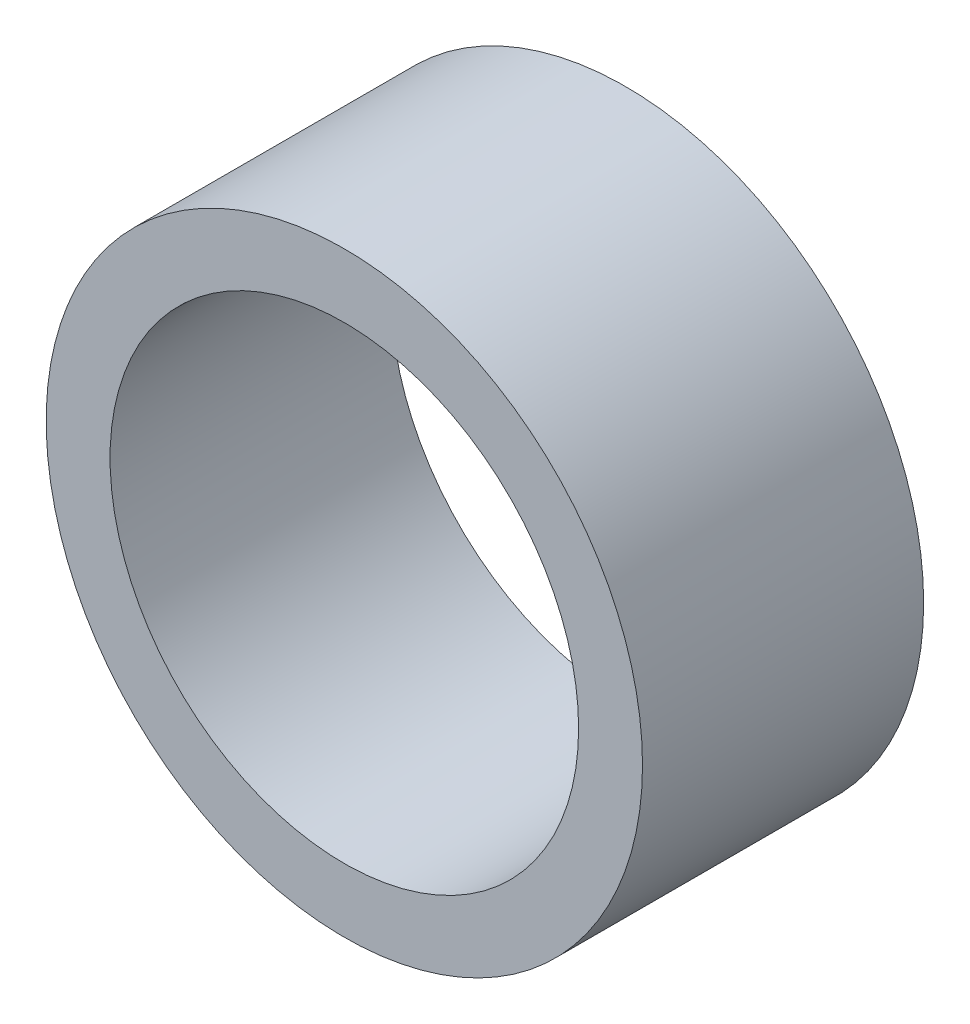
ISO-10303-21;
HEADER;
FILE_DESCRIPTION(('STEP AP214'),'2;1');
FILE_NAME('part.step','',(''),(''),'','','');
FILE_SCHEMA(('AUTOMOTIVE_DESIGN { 1 0 10303 214 1 1 1 1 }'));
ENDSEC;
DATA;
#1=APPLICATION_CONTEXT('core data for automotive mechanical design processes');
#2=APPLICATION_PROTOCOL_DEFINITION('international standard','automotive_design',2000,#1);
#3=PRODUCT_CONTEXT('',#1,'mechanical');
#4=PRODUCT('Part','Part','',(#3));
#5=PRODUCT_RELATED_PRODUCT_CATEGORY('part','',(#4));
#6=PRODUCT_DEFINITION_FORMATION('','',#4);
#7=PRODUCT_DEFINITION_CONTEXT('part definition',#1,'design');
#8=PRODUCT_DEFINITION('design','',#6,#7);
#9=PRODUCT_DEFINITION_SHAPE('','',#8);
#10=(LENGTH_UNIT() NAMED_UNIT(*) SI_UNIT(.MILLI.,.METRE.));
#11=(NAMED_UNIT(*) PLANE_ANGLE_UNIT() SI_UNIT($,.RADIAN.));
#12=(NAMED_UNIT(*) SI_UNIT($,.STERADIAN.) SOLID_ANGLE_UNIT());
#13=UNCERTAINTY_MEASURE_WITH_UNIT(LENGTH_MEASURE(1.E-05),#10,'distance_accuracy_value','');
#14=(GEOMETRIC_REPRESENTATION_CONTEXT(3) GLOBAL_UNCERTAINTY_ASSIGNED_CONTEXT((#13)) GLOBAL_UNIT_ASSIGNED_CONTEXT((#10,
#11,#12)) REPRESENTATION_CONTEXT('',''));
#15=CARTESIAN_POINT('',(0.,0.,0.));
#16=DIRECTION('',(0.,0.,1.));
#17=DIRECTION('',(1.,0.,0.));
#18=AXIS2_PLACEMENT_3D('',#15,#16,#17);
#19=CARTESIAN_POINT('',(0.,0.,13.2));
#20=DIRECTION('',(0.,0.,1.));
#21=DIRECTION('',(1.,0.,0.));
#22=AXIS2_PLACEMENT_3D('',#19,#20,#21);
#23=PLANE('',#22);
#24=CARTESIAN_POINT('',(0.,0.,13.2));
#25=DIRECTION('',(0.,0.,1.));
#26=DIRECTION('',(1.,0.,0.));
#27=AXIS2_PLACEMENT_3D('',#24,#25,#26);
#28=CIRCLE('',#27,14.);
#29=CARTESIAN_POINT('',(14.,0.,13.2));
#30=VERTEX_POINT('',#29);
#31=EDGE_CURVE('E12',#30,#30,#28,.T.);
#32=ORIENTED_EDGE('',*,*,#31,.T.);
#33=EDGE_LOOP('',(#32));
#34=FACE_BOUND('',#33,.T.);
#35=CARTESIAN_POINT('',(0.,0.,13.2));
#36=DIRECTION('',(0.,0.,1.));
#37=DIRECTION('',(1.,0.,0.));
#38=AXIS2_PLACEMENT_3D('',#35,#36,#37);
#39=CIRCLE('',#38,11.);
#40=CARTESIAN_POINT('',(11.,0.,13.2));
#41=VERTEX_POINT('',#40);
#42=EDGE_CURVE('E58',#41,#41,#39,.T.);
#43=ORIENTED_EDGE('',*,*,#42,.F.);
#44=EDGE_LOOP('',(#43));
#45=FACE_BOUND('',#44,.T.);
#46=ADVANCED_FACE('F44',(#34,#45),#23,.T.);
#47=CARTESIAN_POINT('',(0.,0.,0.));
#48=DIRECTION('',(0.,0.,1.));
#49=DIRECTION('',(1.,0.,0.));
#50=AXIS2_PLACEMENT_3D('',#47,#48,#49);
#51=PLANE('',#50);
#52=CARTESIAN_POINT('',(0.,0.,0.));
#53=DIRECTION('',(0.,0.,1.));
#54=DIRECTION('',(1.,0.,0.));
#55=AXIS2_PLACEMENT_3D('',#52,#53,#54);
#56=CIRCLE('',#55,14.);
#57=CARTESIAN_POINT('',(14.,0.,0.));
#58=VERTEX_POINT('',#57);
#59=EDGE_CURVE('E48',#58,#58,#56,.T.);
#60=ORIENTED_EDGE('',*,*,#59,.F.);
#61=EDGE_LOOP('',(#60));
#62=FACE_BOUND('',#61,.T.);
#63=CARTESIAN_POINT('',(0.,0.,0.));
#64=DIRECTION('',(0.,0.,1.));
#65=DIRECTION('',(1.,0.,0.));
#66=AXIS2_PLACEMENT_3D('',#63,#64,#65);
#67=CIRCLE('',#66,11.);
#68=CARTESIAN_POINT('',(11.,0.,0.));
#69=VERTEX_POINT('',#68);
#70=EDGE_CURVE('E60',#69,#69,#67,.T.);
#71=ORIENTED_EDGE('',*,*,#70,.T.);
#72=EDGE_LOOP('',(#71));
#73=FACE_BOUND('',#72,.T.);
#74=ADVANCED_FACE('F71',(#62,#73),#51,.F.);
#75=CARTESIAN_POINT('',(0.,0.,13.2));
#76=DIRECTION('',(0.,0.,-1.));
#77=DIRECTION('',(-1.,0.,0.));
#78=AXIS2_PLACEMENT_3D('',#75,#76,#77);
#79=CYLINDRICAL_SURFACE('',#78,14.);
#80=ORIENTED_EDGE('',*,*,#31,.F.);
#81=EDGE_LOOP('',(#80));
#82=FACE_BOUND('',#81,.T.);
#83=ORIENTED_EDGE('',*,*,#59,.T.);
#84=EDGE_LOOP('',(#83));
#85=FACE_BOUND('',#84,.T.);
#86=ADVANCED_FACE('F46',(#82,#85),#79,.T.);
#87=CARTESIAN_POINT('',(0.,0.,13.2));
#88=DIRECTION('',(0.,0.,-1.));
#89=DIRECTION('',(-1.,0.,0.));
#90=AXIS2_PLACEMENT_3D('',#87,#88,#89);
#91=CYLINDRICAL_SURFACE('',#90,11.);
#92=ORIENTED_EDGE('',*,*,#42,.T.);
#93=EDGE_LOOP('',(#92));
#94=FACE_BOUND('',#93,.T.);
#95=ORIENTED_EDGE('',*,*,#70,.F.);
#96=EDGE_LOOP('',(#95));
#97=FACE_BOUND('',#96,.T.);
#98=ADVANCED_FACE('F67',(#94,#97),#91,.F.);
#99=CLOSED_SHELL('',(#46,#74,#86,#98));
#100=MANIFOLD_SOLID_BREP('B2',#99);
#101=ADVANCED_BREP_SHAPE_REPRESENTATION('',(#18,#100),#14);
#102=SHAPE_DEFINITION_REPRESENTATION(#9,#101);
ENDSEC;
END-ISO-10303-21;
